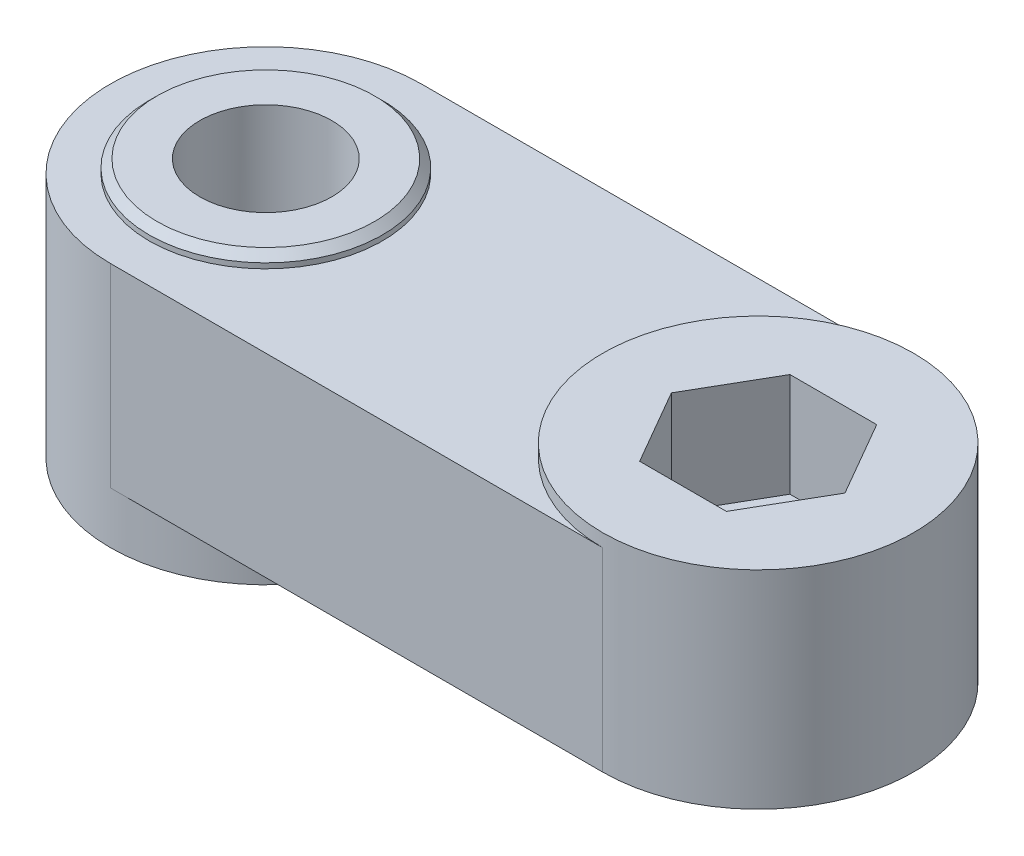
ISO-10303-21;
HEADER;
FILE_DESCRIPTION(('STEP AP214'),'2;1');
FILE_NAME('part.step','',(''),(''),'','','');
FILE_SCHEMA(('AUTOMOTIVE_DESIGN { 1 0 10303 214 1 1 1 1 }'));
ENDSEC;
DATA;
#1=APPLICATION_CONTEXT('core data for automotive mechanical design processes');
#2=APPLICATION_PROTOCOL_DEFINITION('international standard','automotive_design',2000,#1);
#3=PRODUCT_CONTEXT('',#1,'mechanical');
#4=PRODUCT('Part','Part','',(#3));
#5=PRODUCT_RELATED_PRODUCT_CATEGORY('part','',(#4));
#6=PRODUCT_DEFINITION_FORMATION('','',#4);
#7=PRODUCT_DEFINITION_CONTEXT('part definition',#1,'design');
#8=PRODUCT_DEFINITION('design','',#6,#7);
#9=PRODUCT_DEFINITION_SHAPE('','',#8);
#10=(LENGTH_UNIT() NAMED_UNIT(*) SI_UNIT(.MILLI.,.METRE.));
#11=(NAMED_UNIT(*) PLANE_ANGLE_UNIT() SI_UNIT($,.RADIAN.));
#12=(NAMED_UNIT(*) SI_UNIT($,.STERADIAN.) SOLID_ANGLE_UNIT());
#13=UNCERTAINTY_MEASURE_WITH_UNIT(LENGTH_MEASURE(1.E-05),#10,'distance_accuracy_value','');
#14=(GEOMETRIC_REPRESENTATION_CONTEXT(3) GLOBAL_UNCERTAINTY_ASSIGNED_CONTEXT((#13)) GLOBAL_UNIT_ASSIGNED_CONTEXT((#10,
#11,#12)) REPRESENTATION_CONTEXT('',''));
#15=CARTESIAN_POINT('',(0.,0.,0.));
#16=DIRECTION('',(0.,0.,1.));
#17=DIRECTION('',(1.,0.,0.));
#18=AXIS2_PLACEMENT_3D('',#15,#16,#17);
#19=CARTESIAN_POINT('',(0.,10.,0.));
#20=DIRECTION('',(0.,1.,0.));
#21=DIRECTION('',(0.,0.,1.));
#22=AXIS2_PLACEMENT_3D('',#19,#20,#21);
#23=PLANE('',#22);
#24=CARTESIAN_POINT('',(0.,10.,0.));
#25=DIRECTION('',(0.,1.,0.));
#26=DIRECTION('',(0.,0.,1.));
#27=AXIS2_PLACEMENT_3D('',#24,#25,#26);
#28=CIRCLE('',#27,4.2);
#29=CARTESIAN_POINT('',(0.,10.,4.2));
#30=VERTEX_POINT('',#29);
#31=EDGE_CURVE('E50',#30,#30,#28,.T.);
#32=ORIENTED_EDGE('',*,*,#31,.T.);
#33=EDGE_LOOP('',(#32));
#34=FACE_BOUND('',#33,.T.);
#35=CARTESIAN_POINT('',(0.,10.,0.));
#36=DIRECTION('',(0.,1.,0.));
#37=DIRECTION('',(0.,0.,1.));
#38=AXIS2_PLACEMENT_3D('',#35,#36,#37);
#39=CIRCLE('',#38,2.55);
#40=CARTESIAN_POINT('',(0.,10.,2.55));
#41=VERTEX_POINT('',#40);
#42=EDGE_CURVE('E366',#41,#41,#39,.T.);
#43=ORIENTED_EDGE('',*,*,#42,.F.);
#44=EDGE_LOOP('',(#43));
#45=FACE_BOUND('',#44,.T.);
#46=ADVANCED_FACE('F41',(#34,#45),#23,.T.);
#47=CARTESIAN_POINT('',(0.,10.,0.));
#48=DIRECTION('',(0.,-1.,0.));
#49=DIRECTION('',(0.,0.,-1.));
#50=AXIS2_PLACEMENT_3D('',#47,#48,#49);
#51=CYLINDRICAL_SURFACE('',#50,6.);
#52=CARTESIAN_POINT('',(0.,0.,0.));
#53=DIRECTION('',(0.,1.,0.));
#54=DIRECTION('',(0.,0.,1.));
#55=AXIS2_PLACEMENT_3D('',#52,#53,#54);
#56=CIRCLE('',#55,6.);
#57=CARTESIAN_POINT('',(0.,0.,6.));
#58=VERTEX_POINT('',#57);
#59=EDGE_CURVE('E186',#58,#58,#56,.T.);
#60=ORIENTED_EDGE('',*,*,#59,.T.);
#61=EDGE_LOOP('',(#60));
#62=FACE_BOUND('',#61,.T.);
#63=CARTESIAN_POINT('',(0.,9.5,0.));
#64=DIRECTION('',(0.,1.,0.));
#65=DIRECTION('',(0.,0.,1.));
#66=AXIS2_PLACEMENT_3D('',#63,#64,#65);
#67=CIRCLE('',#66,6.);
#68=CARTESIAN_POINT('',(0.,9.5,6.));
#69=VERTEX_POINT('',#68);
#70=CARTESIAN_POINT('',(0.,9.5,-6.));
#71=VERTEX_POINT('',#70);
#72=EDGE_CURVE('E154',#69,#71,#67,.F.);
#73=ORIENTED_EDGE('',*,*,#72,.T.);
#74=DIRECTION('',(0.,-1.,0.));
#75=VECTOR('',#74,1.);
#76=CARTESIAN_POINT('',(0.,10.,-6.));
#77=LINE('',#76,#75);
#78=CARTESIAN_POINT('',(0.,2.,-6.));
#79=VERTEX_POINT('',#78);
#80=EDGE_CURVE('E159',#71,#79,#77,.T.);
#81=ORIENTED_EDGE('',*,*,#80,.T.);
#82=CARTESIAN_POINT('',(0.,2.,0.));
#83=DIRECTION('',(0.,-1.,0.));
#84=DIRECTION('',(0.,0.,-1.));
#85=AXIS2_PLACEMENT_3D('',#82,#83,#84);
#86=CIRCLE('',#85,6.);
#87=CARTESIAN_POINT('',(0.,2.,6.));
#88=VERTEX_POINT('',#87);
#89=EDGE_CURVE('E195',#79,#88,#86,.T.);
#90=ORIENTED_EDGE('',*,*,#89,.T.);
#91=DIRECTION('',(0.,-1.,0.));
#92=VECTOR('',#91,1.);
#93=CARTESIAN_POINT('',(0.,10.,6.));
#94=LINE('',#93,#92);
#95=EDGE_CURVE('E161',#69,#88,#94,.T.);
#96=ORIENTED_EDGE('',*,*,#95,.F.);
#97=EDGE_LOOP('',(#73,#81,#90,#96));
#98=FACE_BOUND('',#97,.T.);
#99=ADVANCED_FACE('F156',(#62,#98),#51,.T.);
#100=CARTESIAN_POINT('',(0.,10.,6.));
#101=DIRECTION('',(0.,0.,-1.));
#102=DIRECTION('',(-1.,0.,0.));
#103=AXIS2_PLACEMENT_3D('',#100,#101,#102);
#104=PLANE('',#103);
#105=DIRECTION('',(1.,0.,0.));
#106=VECTOR('',#105,1.);
#107=CARTESIAN_POINT('',(0.,9.5,6.));
#108=LINE('',#107,#106);
#109=CARTESIAN_POINT('',(19.,9.5,6.));
#110=VERTEX_POINT('',#109);
#111=EDGE_CURVE('E174',#69,#110,#108,.T.);
#112=ORIENTED_EDGE('',*,*,#111,.F.);
#113=ORIENTED_EDGE('',*,*,#95,.T.);
#114=DIRECTION('',(-1.,0.,0.));
#115=VECTOR('',#114,1.);
#116=CARTESIAN_POINT('',(0.,2.,6.));
#117=LINE('',#116,#115);
#118=CARTESIAN_POINT('',(19.,2.,6.));
#119=VERTEX_POINT('',#118);
#120=EDGE_CURVE('E309',#119,#88,#117,.T.);
#121=ORIENTED_EDGE('',*,*,#120,.F.);
#122=DIRECTION('',(0.,-1.,0.));
#123=VECTOR('',#122,1.);
#124=CARTESIAN_POINT('',(19.,10.,6.));
#125=LINE('',#124,#123);
#126=EDGE_CURVE('E183',#110,#119,#125,.T.);
#127=ORIENTED_EDGE('',*,*,#126,.F.);
#128=EDGE_LOOP('',(#112,#113,#121,#127));
#129=FACE_BOUND('',#128,.T.);
#130=ADVANCED_FACE('F219',(#129),#104,.F.);
#131=CARTESIAN_POINT('',(0.,10.,-6.));
#132=DIRECTION('',(0.,0.,1.));
#133=DIRECTION('',(1.,0.,0.));
#134=AXIS2_PLACEMENT_3D('',#131,#132,#133);
#135=PLANE('',#134);
#136=DIRECTION('',(-1.,0.,0.));
#137=VECTOR('',#136,1.);
#138=CARTESIAN_POINT('',(0.,9.5,-6.));
#139=LINE('',#138,#137);
#140=CARTESIAN_POINT('',(19.,9.5,-6.));
#141=VERTEX_POINT('',#140);
#142=EDGE_CURVE('E168',#141,#71,#139,.T.);
#143=ORIENTED_EDGE('',*,*,#142,.F.);
#144=DIRECTION('',(0.,-1.,0.));
#145=VECTOR('',#144,1.);
#146=CARTESIAN_POINT('',(19.,10.,-6.));
#147=LINE('',#146,#145);
#148=CARTESIAN_POINT('',(19.,2.,-6.));
#149=VERTEX_POINT('',#148);
#150=EDGE_CURVE('E180',#141,#149,#147,.T.);
#151=ORIENTED_EDGE('',*,*,#150,.T.);
#152=DIRECTION('',(1.,0.,0.));
#153=VECTOR('',#152,1.);
#154=CARTESIAN_POINT('',(0.,2.,-6.));
#155=LINE('',#154,#153);
#156=EDGE_CURVE('E179',#79,#149,#155,.T.);
#157=ORIENTED_EDGE('',*,*,#156,.F.);
#158=ORIENTED_EDGE('',*,*,#80,.F.);
#159=EDGE_LOOP('',(#143,#151,#157,#158));
#160=FACE_BOUND('',#159,.T.);
#161=ADVANCED_FACE('F177',(#160),#135,.F.);
#162=DIRECTION('',(-1.,0.,0.));
#163=VECTOR('',#162,1.);
#164=CARTESIAN_POINT('',(20.6743157806499,10.,-2.9));
#165=LINE('',#164,#163);
#166=CARTESIAN_POINT('',(20.6743157806499,10.,-2.9));
#167=VERTEX_POINT('',#166);
#168=CARTESIAN_POINT('',(17.3256842193501,10.,-2.9));
#169=VERTEX_POINT('',#168);
#170=EDGE_CURVE('E57',#167,#169,#165,.T.);
#171=ORIENTED_EDGE('',*,*,#170,.F.);
#172=DIRECTION('',(-0.5,0.,-0.866025403784439));
#173=VECTOR('',#172,1.);
#174=CARTESIAN_POINT('',(22.3486315612998,10.,0.));
#175=LINE('',#174,#173);
#176=CARTESIAN_POINT('',(22.3486315612998,10.,0.));
#177=VERTEX_POINT('',#176);
#178=EDGE_CURVE('E265',#177,#167,#175,.T.);
#179=ORIENTED_EDGE('',*,*,#178,.F.);
#180=DIRECTION('',(0.5,0.,-0.866025403784439));
#181=VECTOR('',#180,1.);
#182=CARTESIAN_POINT('',(20.6743157806499,10.,2.9));
#183=LINE('',#182,#181);
#184=CARTESIAN_POINT('',(20.6743157806499,10.,2.9));
#185=VERTEX_POINT('',#184);
#186=EDGE_CURVE('E289',#185,#177,#183,.T.);
#187=ORIENTED_EDGE('',*,*,#186,.F.);
#188=DIRECTION('',(1.,0.,0.));
#189=VECTOR('',#188,1.);
#190=CARTESIAN_POINT('',(17.3256842193501,10.,2.9));
#191=LINE('',#190,#189);
#192=CARTESIAN_POINT('',(17.3256842193501,10.,2.9));
#193=VERTEX_POINT('',#192);
#194=EDGE_CURVE('E286',#193,#185,#191,.T.);
#195=ORIENTED_EDGE('',*,*,#194,.F.);
#196=DIRECTION('',(0.5,0.,0.866025403784439));
#197=VECTOR('',#196,1.);
#198=CARTESIAN_POINT('',(15.6513684387002,10.,0.));
#199=LINE('',#198,#197);
#200=CARTESIAN_POINT('',(15.6513684387002,10.,0.));
#201=VERTEX_POINT('',#200);
#202=EDGE_CURVE('E283',#201,#193,#199,.T.);
#203=ORIENTED_EDGE('',*,*,#202,.F.);
#204=DIRECTION('',(-0.5,0.,0.866025403784439));
#205=VECTOR('',#204,1.);
#206=CARTESIAN_POINT('',(17.3256842193501,10.,-2.9));
#207=LINE('',#206,#205);
#208=EDGE_CURVE('E257',#169,#201,#207,.T.);
#209=ORIENTED_EDGE('',*,*,#208,.F.);
#210=EDGE_LOOP('',(#171,#179,#187,#195,#203,#209));
#211=FACE_BOUND('',#210,.T.);
#212=CARTESIAN_POINT('',(19.,10.,0.));
#213=DIRECTION('',(0.,1.,0.));
#214=DIRECTION('',(0.,0.,1.));
#215=AXIS2_PLACEMENT_3D('',#212,#213,#214);
#216=CIRCLE('',#215,6.);
#217=CARTESIAN_POINT('',(19.,10.,6.));
#218=VERTEX_POINT('',#217);
#219=EDGE_CURVE('E181',#218,#218,#216,.T.);
#220=ORIENTED_EDGE('',*,*,#219,.T.);
#221=EDGE_LOOP('',(#220));
#222=FACE_BOUND('',#221,.T.);
#223=ADVANCED_FACE('F215',(#211,#222),#23,.T.);
#224=CARTESIAN_POINT('',(19.,10.,0.));
#225=DIRECTION('',(0.,1.,0.));
#226=DIRECTION('',(0.,0.,1.));
#227=AXIS2_PLACEMENT_3D('',#224,#225,#226);
#228=CYLINDRICAL_SURFACE('',#227,2.5);
#229=CARTESIAN_POINT('',(19.,5.,0.));
#230=DIRECTION('',(0.,1.,0.));
#231=DIRECTION('',(0.,0.,1.));
#232=AXIS2_PLACEMENT_3D('',#229,#230,#231);
#233=CIRCLE('',#232,2.5);
#234=CARTESIAN_POINT('',(19.,5.,2.5));
#235=VERTEX_POINT('',#234);
#236=EDGE_CURVE('E363',#235,#235,#233,.T.);
#237=ORIENTED_EDGE('',*,*,#236,.F.);
#238=EDGE_LOOP('',(#237));
#239=FACE_BOUND('',#238,.T.);
#240=CARTESIAN_POINT('',(19.,6.,0.));
#241=DIRECTION('',(0.,1.,0.));
#242=DIRECTION('',(0.,0.,1.));
#243=AXIS2_PLACEMENT_3D('',#240,#241,#242);
#244=CIRCLE('',#243,2.5);
#245=CARTESIAN_POINT('',(19.,6.,2.5));
#246=VERTEX_POINT('',#245);
#247=EDGE_CURVE('E196',#246,#246,#244,.F.);
#248=ORIENTED_EDGE('',*,*,#247,.F.);
#249=EDGE_LOOP('',(#248));
#250=FACE_BOUND('',#249,.T.);
#251=ADVANCED_FACE('F224',(#239,#250),#228,.F.);
#252=CARTESIAN_POINT('',(19.,10.,0.));
#253=DIRECTION('',(0.,-1.,0.));
#254=DIRECTION('',(0.,0.,-1.));
#255=AXIS2_PLACEMENT_3D('',#252,#253,#254);
#256=CYLINDRICAL_SURFACE('',#255,6.);
#257=CARTESIAN_POINT('',(19.,9.5,0.));
#258=DIRECTION('',(0.,1.,0.));
#259=DIRECTION('',(0.,0.,1.));
#260=AXIS2_PLACEMENT_3D('',#257,#258,#259);
#261=CIRCLE('',#260,6.);
#262=EDGE_CURVE('E164',#141,#110,#261,.T.);
#263=ORIENTED_EDGE('',*,*,#262,.T.);
#264=ORIENTED_EDGE('',*,*,#126,.T.);
#265=CARTESIAN_POINT('',(19.,2.,0.));
#266=DIRECTION('',(0.,-1.,0.));
#267=DIRECTION('',(0.,0.,-1.));
#268=AXIS2_PLACEMENT_3D('',#265,#266,#267);
#269=CIRCLE('',#268,6.);
#270=EDGE_CURVE('E306',#149,#119,#269,.T.);
#271=ORIENTED_EDGE('',*,*,#270,.F.);
#272=ORIENTED_EDGE('',*,*,#150,.F.);
#273=EDGE_LOOP('',(#263,#264,#271,#272));
#274=FACE_BOUND('',#273,.T.);
#275=ORIENTED_EDGE('',*,*,#219,.F.);
#276=EDGE_LOOP('',(#275));
#277=FACE_BOUND('',#276,.T.);
#278=ADVANCED_FACE('F230',(#274,#277),#256,.T.);
#279=CARTESIAN_POINT('',(0.,0.,0.));
#280=DIRECTION('',(0.,1.,0.));
#281=DIRECTION('',(0.,0.,1.));
#282=AXIS2_PLACEMENT_3D('',#279,#280,#281);
#283=PLANE('',#282);
#284=DIRECTION('',(0.5,0.,-0.866025403784439));
#285=VECTOR('',#284,1.);
#286=CARTESIAN_POINT('',(-4.21465696508427,0.,0.));
#287=LINE('',#286,#285);
#288=CARTESIAN_POINT('',(-4.21465696508427,0.,0.));
#289=VERTEX_POINT('',#288);
#290=CARTESIAN_POINT('',(-2.10732848254214,0.,-3.65));
#291=VERTEX_POINT('',#290);
#292=EDGE_CURVE('E332',#289,#291,#287,.T.);
#293=ORIENTED_EDGE('',*,*,#292,.F.);
#294=DIRECTION('',(-0.5,0.,-0.866025403784438));
#295=VECTOR('',#294,1.);
#296=CARTESIAN_POINT('',(-2.10732848254213,0.,3.65));
#297=LINE('',#296,#295);
#298=CARTESIAN_POINT('',(-2.10732848254213,0.,3.65));
#299=VERTEX_POINT('',#298);
#300=EDGE_CURVE('E65',#299,#289,#297,.T.);
#301=ORIENTED_EDGE('',*,*,#300,.F.);
#302=DIRECTION('',(-1.,0.,0.));
#303=VECTOR('',#302,1.);
#304=CARTESIAN_POINT('',(2.10732848254214,0.,3.65));
#305=LINE('',#304,#303);
#306=CARTESIAN_POINT('',(2.10732848254214,0.,3.65));
#307=VERTEX_POINT('',#306);
#308=EDGE_CURVE('E315',#307,#299,#305,.T.);
#309=ORIENTED_EDGE('',*,*,#308,.F.);
#310=DIRECTION('',(-0.5,0.,0.866025403784439));
#311=VECTOR('',#310,1.);
#312=CARTESIAN_POINT('',(4.21465696508427,0.,0.));
#313=LINE('',#312,#311);
#314=CARTESIAN_POINT('',(4.21465696508427,0.,0.));
#315=VERTEX_POINT('',#314);
#316=EDGE_CURVE('E341',#315,#307,#313,.T.);
#317=ORIENTED_EDGE('',*,*,#316,.F.);
#318=DIRECTION('',(0.5,0.,0.866025403784439));
#319=VECTOR('',#318,1.);
#320=CARTESIAN_POINT('',(2.10732848254213,0.,-3.65));
#321=LINE('',#320,#319);
#322=CARTESIAN_POINT('',(2.10732848254213,0.,-3.65));
#323=VERTEX_POINT('',#322);
#324=EDGE_CURVE('E338',#323,#315,#321,.T.);
#325=ORIENTED_EDGE('',*,*,#324,.F.);
#326=DIRECTION('',(1.,0.,0.));
#327=VECTOR('',#326,1.);
#328=CARTESIAN_POINT('',(-2.10732848254214,0.,-3.65));
#329=LINE('',#328,#327);
#330=EDGE_CURVE('E335',#291,#323,#329,.T.);
#331=ORIENTED_EDGE('',*,*,#330,.F.);
#332=EDGE_LOOP('',(#293,#301,#309,#317,#325,#331));
#333=FACE_BOUND('',#332,.T.);
#334=ORIENTED_EDGE('',*,*,#59,.F.);
#335=EDGE_LOOP('',(#334));
#336=FACE_BOUND('',#335,.T.);
#337=ADVANCED_FACE('F240',(#333,#336),#283,.F.);
#338=CARTESIAN_POINT('',(19.,10.,0.));
#339=DIRECTION('',(0.,1.,0.));
#340=DIRECTION('',(0.,0.,1.));
#341=AXIS2_PLACEMENT_3D('',#338,#339,#340);
#342=CYLINDRICAL_SURFACE('',#341,2.075);
#343=CARTESIAN_POINT('',(19.,5.,0.));
#344=DIRECTION('',(0.,1.,0.));
#345=DIRECTION('',(0.,0.,1.));
#346=AXIS2_PLACEMENT_3D('',#343,#344,#345);
#347=CIRCLE('',#346,2.075);
#348=CARTESIAN_POINT('',(19.,5.,2.075));
#349=VERTEX_POINT('',#348);
#350=EDGE_CURVE('E360',#349,#349,#347,.T.);
#351=ORIENTED_EDGE('',*,*,#350,.T.);
#352=EDGE_LOOP('',(#351));
#353=FACE_BOUND('',#352,.T.);
#354=CARTESIAN_POINT('',(19.,2.,0.));
#355=DIRECTION('',(0.,-1.,0.));
#356=DIRECTION('',(0.,0.,-1.));
#357=AXIS2_PLACEMENT_3D('',#354,#355,#356);
#358=CIRCLE('',#357,2.075);
#359=CARTESIAN_POINT('',(19.,2.,-2.075));
#360=VERTEX_POINT('',#359);
#361=EDGE_CURVE('E192',#360,#360,#358,.F.);
#362=ORIENTED_EDGE('',*,*,#361,.F.);
#363=EDGE_LOOP('',(#362));
#364=FACE_BOUND('',#363,.T.);
#365=ADVANCED_FACE('F246',(#353,#364),#342,.F.);
#366=CARTESIAN_POINT('',(0.,10.,0.));
#367=DIRECTION('',(0.,1.,0.));
#368=DIRECTION('',(0.,0.,1.));
#369=AXIS2_PLACEMENT_3D('',#366,#367,#368);
#370=CYLINDRICAL_SURFACE('',#369,2.55);
#371=CARTESIAN_POINT('',(0.,5.,0.));
#372=DIRECTION('',(0.,-1.,0.));
#373=DIRECTION('',(0.,0.,-1.));
#374=AXIS2_PLACEMENT_3D('',#371,#372,#373);
#375=CIRCLE('',#374,2.55);
#376=CARTESIAN_POINT('',(0.,5.,-2.55));
#377=VERTEX_POINT('',#376);
#378=EDGE_CURVE('E348',#377,#377,#375,.F.);
#379=ORIENTED_EDGE('',*,*,#378,.F.);
#380=EDGE_LOOP('',(#379));
#381=FACE_BOUND('',#380,.T.);
#382=ORIENTED_EDGE('',*,*,#42,.T.);
#383=EDGE_LOOP('',(#382));
#384=FACE_BOUND('',#383,.T.);
#385=ADVANCED_FACE('F373',(#381,#384),#370,.F.);
#386=CARTESIAN_POINT('',(16.5,5.,0.));
#387=DIRECTION('',(0.,-1.,0.));
#388=DIRECTION('',(0.,0.,-1.));
#389=AXIS2_PLACEMENT_3D('',#386,#387,#388);
#390=PLANE('',#389);
#391=ORIENTED_EDGE('',*,*,#350,.F.);
#392=EDGE_LOOP('',(#391));
#393=FACE_BOUND('',#392,.T.);
#394=ORIENTED_EDGE('',*,*,#236,.T.);
#395=EDGE_LOOP('',(#394));
#396=FACE_BOUND('',#395,.T.);
#397=ADVANCED_FACE('F375',(#393,#396),#390,.F.);
#398=CARTESIAN_POINT('',(0.,5.,0.));
#399=DIRECTION('',(0.,-1.,0.));
#400=DIRECTION('',(0.,0.,-1.));
#401=AXIS2_PLACEMENT_3D('',#398,#399,#400);
#402=PLANE('',#401);
#403=DIRECTION('',(-0.5,0.,-0.866025403784438));
#404=VECTOR('',#403,1.);
#405=CARTESIAN_POINT('',(-2.10732848254213,5.,3.65));
#406=LINE('',#405,#404);
#407=CARTESIAN_POINT('',(-2.10732848254213,5.,3.65));
#408=VERTEX_POINT('',#407);
#409=CARTESIAN_POINT('',(-4.21465696508427,5.,0.));
#410=VERTEX_POINT('',#409);
#411=EDGE_CURVE('E311',#408,#410,#406,.T.);
#412=ORIENTED_EDGE('',*,*,#411,.T.);
#413=DIRECTION('',(0.5,0.,-0.866025403784439));
#414=VECTOR('',#413,1.);
#415=CARTESIAN_POINT('',(-4.21465696508427,5.,0.));
#416=LINE('',#415,#414);
#417=CARTESIAN_POINT('',(-2.10732848254214,5.,-3.65));
#418=VERTEX_POINT('',#417);
#419=EDGE_CURVE('E314',#410,#418,#416,.T.);
#420=ORIENTED_EDGE('',*,*,#419,.T.);
#421=DIRECTION('',(1.,0.,0.));
#422=VECTOR('',#421,1.);
#423=CARTESIAN_POINT('',(-2.10732848254214,5.,-3.65));
#424=LINE('',#423,#422);
#425=CARTESIAN_POINT('',(2.10732848254213,5.,-3.65));
#426=VERTEX_POINT('',#425);
#427=EDGE_CURVE('E318',#418,#426,#424,.T.);
#428=ORIENTED_EDGE('',*,*,#427,.T.);
#429=DIRECTION('',(0.5,0.,0.866025403784439));
#430=VECTOR('',#429,1.);
#431=CARTESIAN_POINT('',(2.10732848254213,5.,-3.65));
#432=LINE('',#431,#430);
#433=CARTESIAN_POINT('',(4.21465696508427,5.,0.));
#434=VERTEX_POINT('',#433);
#435=EDGE_CURVE('E321',#426,#434,#432,.T.);
#436=ORIENTED_EDGE('',*,*,#435,.T.);
#437=DIRECTION('',(-0.5,0.,0.866025403784439));
#438=VECTOR('',#437,1.);
#439=CARTESIAN_POINT('',(4.21465696508427,5.,0.));
#440=LINE('',#439,#438);
#441=CARTESIAN_POINT('',(2.10732848254214,5.,3.65));
#442=VERTEX_POINT('',#441);
#443=EDGE_CURVE('E324',#434,#442,#440,.T.);
#444=ORIENTED_EDGE('',*,*,#443,.T.);
#445=DIRECTION('',(-1.,0.,0.));
#446=VECTOR('',#445,1.);
#447=CARTESIAN_POINT('',(2.10732848254214,5.,3.65));
#448=LINE('',#447,#446);
#449=EDGE_CURVE('E327',#442,#408,#448,.T.);
#450=ORIENTED_EDGE('',*,*,#449,.T.);
#451=EDGE_LOOP('',(#412,#420,#428,#436,#444,#450));
#452=FACE_BOUND('',#451,.T.);
#453=ORIENTED_EDGE('',*,*,#378,.T.);
#454=EDGE_LOOP('',(#453));
#455=FACE_BOUND('',#454,.T.);
#456=ADVANCED_FACE('F381',(#452,#455),#402,.T.);
#457=CARTESIAN_POINT('',(-2.10732848254213,5.,3.65));
#458=DIRECTION('',(-0.866025403784438,0.,0.5));
#459=DIRECTION('',(0.5,0.,0.866025403784439));
#460=AXIS2_PLACEMENT_3D('',#457,#458,#459);
#461=PLANE('',#460);
#462=ORIENTED_EDGE('',*,*,#300,.T.);
#463=DIRECTION('',(0.,-1.,0.));
#464=VECTOR('',#463,1.);
#465=CARTESIAN_POINT('',(-4.21465696508427,5.,0.));
#466=LINE('',#465,#464);
#467=EDGE_CURVE('E330',#410,#289,#466,.T.);
#468=ORIENTED_EDGE('',*,*,#467,.F.);
#469=ORIENTED_EDGE('',*,*,#411,.F.);
#470=DIRECTION('',(0.,-1.,0.));
#471=VECTOR('',#470,1.);
#472=CARTESIAN_POINT('',(-2.10732848254213,5.,3.65));
#473=LINE('',#472,#471);
#474=EDGE_CURVE('E346',#408,#299,#473,.T.);
#475=ORIENTED_EDGE('',*,*,#474,.T.);
#476=EDGE_LOOP('',(#462,#468,#469,#475));
#477=FACE_BOUND('',#476,.T.);
#478=ADVANCED_FACE('F388',(#477),#461,.F.);
#479=CARTESIAN_POINT('',(2.10732848254214,5.,3.65));
#480=DIRECTION('',(0.,0.,1.));
#481=DIRECTION('',(1.,0.,0.));
#482=AXIS2_PLACEMENT_3D('',#479,#480,#481);
#483=PLANE('',#482);
#484=ORIENTED_EDGE('',*,*,#308,.T.);
#485=ORIENTED_EDGE('',*,*,#474,.F.);
#486=ORIENTED_EDGE('',*,*,#449,.F.);
#487=DIRECTION('',(0.,-1.,0.));
#488=VECTOR('',#487,1.);
#489=CARTESIAN_POINT('',(2.10732848254214,5.,3.65));
#490=LINE('',#489,#488);
#491=EDGE_CURVE('E349',#442,#307,#490,.T.);
#492=ORIENTED_EDGE('',*,*,#491,.T.);
#493=EDGE_LOOP('',(#484,#485,#486,#492));
#494=FACE_BOUND('',#493,.T.);
#495=ADVANCED_FACE('F391',(#494),#483,.F.);
#496=CARTESIAN_POINT('',(4.21465696508427,5.,0.));
#497=DIRECTION('',(0.866025403784439,0.,0.5));
#498=DIRECTION('',(0.5,0.,-0.866025403784439));
#499=AXIS2_PLACEMENT_3D('',#496,#497,#498);
#500=PLANE('',#499);
#501=ORIENTED_EDGE('',*,*,#316,.T.);
#502=ORIENTED_EDGE('',*,*,#491,.F.);
#503=ORIENTED_EDGE('',*,*,#443,.F.);
#504=DIRECTION('',(0.,-1.,0.));
#505=VECTOR('',#504,1.);
#506=CARTESIAN_POINT('',(4.21465696508427,5.,0.));
#507=LINE('',#506,#505);
#508=EDGE_CURVE('E351',#434,#315,#507,.T.);
#509=ORIENTED_EDGE('',*,*,#508,.T.);
#510=EDGE_LOOP('',(#501,#502,#503,#509));
#511=FACE_BOUND('',#510,.T.);
#512=ADVANCED_FACE('F404',(#511),#500,.F.);
#513=CARTESIAN_POINT('',(2.10732848254213,5.,-3.65));
#514=DIRECTION('',(0.866025403784439,0.,-0.5));
#515=DIRECTION('',(-0.5,0.,-0.866025403784439));
#516=AXIS2_PLACEMENT_3D('',#513,#514,#515);
#517=PLANE('',#516);
#518=ORIENTED_EDGE('',*,*,#324,.T.);
#519=ORIENTED_EDGE('',*,*,#508,.F.);
#520=ORIENTED_EDGE('',*,*,#435,.F.);
#521=DIRECTION('',(0.,-1.,0.));
#522=VECTOR('',#521,1.);
#523=CARTESIAN_POINT('',(2.10732848254213,5.,-3.65));
#524=LINE('',#523,#522);
#525=EDGE_CURVE('E353',#426,#323,#524,.T.);
#526=ORIENTED_EDGE('',*,*,#525,.T.);
#527=EDGE_LOOP('',(#518,#519,#520,#526));
#528=FACE_BOUND('',#527,.T.);
#529=ADVANCED_FACE('F400',(#528),#517,.F.);
#530=CARTESIAN_POINT('',(-2.10732848254214,5.,-3.65));
#531=DIRECTION('',(0.,0.,-1.));
#532=DIRECTION('',(-1.,0.,0.));
#533=AXIS2_PLACEMENT_3D('',#530,#531,#532);
#534=PLANE('',#533);
#535=ORIENTED_EDGE('',*,*,#330,.T.);
#536=ORIENTED_EDGE('',*,*,#525,.F.);
#537=ORIENTED_EDGE('',*,*,#427,.F.);
#538=DIRECTION('',(0.,-1.,0.));
#539=VECTOR('',#538,1.);
#540=CARTESIAN_POINT('',(-2.10732848254214,5.,-3.65));
#541=LINE('',#540,#539);
#542=EDGE_CURVE('E355',#418,#291,#541,.T.);
#543=ORIENTED_EDGE('',*,*,#542,.T.);
#544=EDGE_LOOP('',(#535,#536,#537,#543));
#545=FACE_BOUND('',#544,.T.);
#546=ADVANCED_FACE('F396',(#545),#534,.F.);
#547=CARTESIAN_POINT('',(-4.21465696508427,5.,0.));
#548=DIRECTION('',(-0.866025403784439,0.,-0.5));
#549=DIRECTION('',(-0.5,0.,0.866025403784439));
#550=AXIS2_PLACEMENT_3D('',#547,#548,#549);
#551=PLANE('',#550);
#552=ORIENTED_EDGE('',*,*,#292,.T.);
#553=ORIENTED_EDGE('',*,*,#542,.F.);
#554=ORIENTED_EDGE('',*,*,#419,.F.);
#555=ORIENTED_EDGE('',*,*,#467,.T.);
#556=EDGE_LOOP('',(#552,#553,#554,#555));
#557=FACE_BOUND('',#556,.T.);
#558=ADVANCED_FACE('F392',(#557),#551,.F.);
#559=CARTESIAN_POINT('',(0.,2.,0.));
#560=DIRECTION('',(0.,-1.,0.));
#561=DIRECTION('',(0.,0.,-1.));
#562=AXIS2_PLACEMENT_3D('',#559,#560,#561);
#563=PLANE('',#562);
#564=ORIENTED_EDGE('',*,*,#361,.T.);
#565=EDGE_LOOP('',(#564));
#566=FACE_BOUND('',#565,.T.);
#567=ORIENTED_EDGE('',*,*,#120,.T.);
#568=ORIENTED_EDGE('',*,*,#89,.F.);
#569=ORIENTED_EDGE('',*,*,#156,.T.);
#570=ORIENTED_EDGE('',*,*,#270,.T.);
#571=EDGE_LOOP('',(#567,#568,#569,#570));
#572=FACE_BOUND('',#571,.T.);
#573=ADVANCED_FACE('F395',(#566,#572),#563,.T.);
#574=CARTESIAN_POINT('',(0.,6.,0.));
#575=DIRECTION('',(0.,1.,0.));
#576=DIRECTION('',(0.,0.,1.));
#577=AXIS2_PLACEMENT_3D('',#574,#575,#576);
#578=PLANE('',#577);
#579=DIRECTION('',(-1.,0.,0.));
#580=VECTOR('',#579,1.);
#581=CARTESIAN_POINT('',(20.6743157806499,6.,-2.9));
#582=LINE('',#581,#580);
#583=CARTESIAN_POINT('',(20.6743157806499,6.,-2.9));
#584=VERTEX_POINT('',#583);
#585=CARTESIAN_POINT('',(17.3256842193501,6.,-2.9));
#586=VERTEX_POINT('',#585);
#587=EDGE_CURVE('E261',#584,#586,#582,.T.);
#588=ORIENTED_EDGE('',*,*,#587,.T.);
#589=DIRECTION('',(-0.5,0.,0.866025403784439));
#590=VECTOR('',#589,1.);
#591=CARTESIAN_POINT('',(17.3256842193501,6.,-2.9));
#592=LINE('',#591,#590);
#593=CARTESIAN_POINT('',(15.6513684387002,6.,0.));
#594=VERTEX_POINT('',#593);
#595=EDGE_CURVE('E264',#586,#594,#592,.T.);
#596=ORIENTED_EDGE('',*,*,#595,.T.);
#597=DIRECTION('',(0.5,0.,0.866025403784439));
#598=VECTOR('',#597,1.);
#599=CARTESIAN_POINT('',(15.6513684387002,6.,0.));
#600=LINE('',#599,#598);
#601=CARTESIAN_POINT('',(17.3256842193501,6.,2.9));
#602=VERTEX_POINT('',#601);
#603=EDGE_CURVE('E268',#594,#602,#600,.T.);
#604=ORIENTED_EDGE('',*,*,#603,.T.);
#605=DIRECTION('',(1.,0.,0.));
#606=VECTOR('',#605,1.);
#607=CARTESIAN_POINT('',(17.3256842193501,6.,2.9));
#608=LINE('',#607,#606);
#609=CARTESIAN_POINT('',(20.6743157806499,6.,2.9));
#610=VERTEX_POINT('',#609);
#611=EDGE_CURVE('E271',#602,#610,#608,.T.);
#612=ORIENTED_EDGE('',*,*,#611,.T.);
#613=DIRECTION('',(0.5,0.,-0.866025403784439));
#614=VECTOR('',#613,1.);
#615=CARTESIAN_POINT('',(20.6743157806499,6.,2.9));
#616=LINE('',#615,#614);
#617=CARTESIAN_POINT('',(22.3486315612998,6.,0.));
#618=VERTEX_POINT('',#617);
#619=EDGE_CURVE('E274',#610,#618,#616,.T.);
#620=ORIENTED_EDGE('',*,*,#619,.T.);
#621=DIRECTION('',(-0.5,0.,-0.866025403784439));
#622=VECTOR('',#621,1.);
#623=CARTESIAN_POINT('',(22.3486315612998,6.,0.));
#624=LINE('',#623,#622);
#625=EDGE_CURVE('E277',#618,#584,#624,.T.);
#626=ORIENTED_EDGE('',*,*,#625,.T.);
#627=EDGE_LOOP('',(#588,#596,#604,#612,#620,#626));
#628=FACE_BOUND('',#627,.T.);
#629=ORIENTED_EDGE('',*,*,#247,.T.);
#630=EDGE_LOOP('',(#629));
#631=FACE_BOUND('',#630,.T.);
#632=ADVANCED_FACE('F417',(#628,#631),#578,.T.);
#633=CARTESIAN_POINT('',(20.6743157806499,6.,-2.9));
#634=DIRECTION('',(0.,0.,-1.));
#635=DIRECTION('',(-1.,0.,0.));
#636=AXIS2_PLACEMENT_3D('',#633,#634,#635);
#637=PLANE('',#636);
#638=ORIENTED_EDGE('',*,*,#170,.T.);
#639=DIRECTION('',(0.,1.,0.));
#640=VECTOR('',#639,1.);
#641=CARTESIAN_POINT('',(17.3256842193501,6.,-2.9));
#642=LINE('',#641,#640);
#643=EDGE_CURVE('E279',#586,#169,#642,.T.);
#644=ORIENTED_EDGE('',*,*,#643,.F.);
#645=ORIENTED_EDGE('',*,*,#587,.F.);
#646=DIRECTION('',(0.,1.,0.));
#647=VECTOR('',#646,1.);
#648=CARTESIAN_POINT('',(20.6743157806499,6.,-2.9));
#649=LINE('',#648,#647);
#650=EDGE_CURVE('E198',#584,#167,#649,.T.);
#651=ORIENTED_EDGE('',*,*,#650,.T.);
#652=EDGE_LOOP('',(#638,#644,#645,#651));
#653=FACE_BOUND('',#652,.T.);
#654=ADVANCED_FACE('F419',(#653),#637,.F.);
#655=CARTESIAN_POINT('',(22.3486315612998,6.,0.));
#656=DIRECTION('',(0.866025403784439,0.,-0.5));
#657=DIRECTION('',(-0.5,0.,-0.866025403784439));
#658=AXIS2_PLACEMENT_3D('',#655,#656,#657);
#659=PLANE('',#658);
#660=ORIENTED_EDGE('',*,*,#178,.T.);
#661=ORIENTED_EDGE('',*,*,#650,.F.);
#662=ORIENTED_EDGE('',*,*,#625,.F.);
#663=DIRECTION('',(0.,1.,0.));
#664=VECTOR('',#663,1.);
#665=CARTESIAN_POINT('',(22.3486315612998,6.,0.));
#666=LINE('',#665,#664);
#667=EDGE_CURVE('E295',#618,#177,#666,.T.);
#668=ORIENTED_EDGE('',*,*,#667,.T.);
#669=EDGE_LOOP('',(#660,#661,#662,#668));
#670=FACE_BOUND('',#669,.T.);
#671=ADVANCED_FACE('F422',(#670),#659,.F.);
#672=CARTESIAN_POINT('',(20.6743157806499,6.,2.9));
#673=DIRECTION('',(0.866025403784439,0.,0.5));
#674=DIRECTION('',(0.5,0.,-0.866025403784439));
#675=AXIS2_PLACEMENT_3D('',#672,#673,#674);
#676=PLANE('',#675);
#677=ORIENTED_EDGE('',*,*,#186,.T.);
#678=ORIENTED_EDGE('',*,*,#667,.F.);
#679=ORIENTED_EDGE('',*,*,#619,.F.);
#680=DIRECTION('',(0.,1.,0.));
#681=VECTOR('',#680,1.);
#682=CARTESIAN_POINT('',(20.6743157806499,6.,2.9));
#683=LINE('',#682,#681);
#684=EDGE_CURVE('E297',#610,#185,#683,.T.);
#685=ORIENTED_EDGE('',*,*,#684,.T.);
#686=EDGE_LOOP('',(#677,#678,#679,#685));
#687=FACE_BOUND('',#686,.T.);
#688=ADVANCED_FACE('F434',(#687),#676,.F.);
#689=CARTESIAN_POINT('',(17.3256842193501,6.,2.9));
#690=DIRECTION('',(0.,0.,1.));
#691=DIRECTION('',(1.,0.,0.));
#692=AXIS2_PLACEMENT_3D('',#689,#690,#691);
#693=PLANE('',#692);
#694=ORIENTED_EDGE('',*,*,#194,.T.);
#695=ORIENTED_EDGE('',*,*,#684,.F.);
#696=ORIENTED_EDGE('',*,*,#611,.F.);
#697=DIRECTION('',(0.,1.,0.));
#698=VECTOR('',#697,1.);
#699=CARTESIAN_POINT('',(17.3256842193501,6.,2.9));
#700=LINE('',#699,#698);
#701=EDGE_CURVE('E299',#602,#193,#700,.T.);
#702=ORIENTED_EDGE('',*,*,#701,.T.);
#703=EDGE_LOOP('',(#694,#695,#696,#702));
#704=FACE_BOUND('',#703,.T.);
#705=ADVANCED_FACE('F430',(#704),#693,.F.);
#706=CARTESIAN_POINT('',(15.6513684387002,6.,0.));
#707=DIRECTION('',(-0.866025403784439,0.,0.5));
#708=DIRECTION('',(0.5,0.,0.866025403784439));
#709=AXIS2_PLACEMENT_3D('',#706,#707,#708);
#710=PLANE('',#709);
#711=ORIENTED_EDGE('',*,*,#202,.T.);
#712=ORIENTED_EDGE('',*,*,#701,.F.);
#713=ORIENTED_EDGE('',*,*,#603,.F.);
#714=DIRECTION('',(0.,1.,0.));
#715=VECTOR('',#714,1.);
#716=CARTESIAN_POINT('',(15.6513684387002,6.,0.));
#717=LINE('',#716,#715);
#718=EDGE_CURVE('E301',#594,#201,#717,.T.);
#719=ORIENTED_EDGE('',*,*,#718,.T.);
#720=EDGE_LOOP('',(#711,#712,#713,#719));
#721=FACE_BOUND('',#720,.T.);
#722=ADVANCED_FACE('F426',(#721),#710,.F.);
#723=CARTESIAN_POINT('',(17.3256842193501,6.,-2.9));
#724=DIRECTION('',(-0.866025403784439,0.,-0.5));
#725=DIRECTION('',(-0.5,0.,0.866025403784439));
#726=AXIS2_PLACEMENT_3D('',#723,#724,#725);
#727=PLANE('',#726);
#728=ORIENTED_EDGE('',*,*,#208,.T.);
#729=ORIENTED_EDGE('',*,*,#718,.F.);
#730=ORIENTED_EDGE('',*,*,#595,.F.);
#731=ORIENTED_EDGE('',*,*,#643,.T.);
#732=EDGE_LOOP('',(#728,#729,#730,#731));
#733=FACE_BOUND('',#732,.T.);
#734=ADVANCED_FACE('F423',(#733),#727,.F.);
#735=CARTESIAN_POINT('',(0.,9.5,0.));
#736=DIRECTION('',(0.,1.,0.));
#737=DIRECTION('',(0.,0.,1.));
#738=AXIS2_PLACEMENT_3D('',#735,#736,#737);
#739=PLANE('',#738);
#740=ORIENTED_EDGE('',*,*,#111,.T.);
#741=ORIENTED_EDGE('',*,*,#262,.F.);
#742=ORIENTED_EDGE('',*,*,#142,.T.);
#743=ORIENTED_EDGE('',*,*,#72,.F.);
#744=EDGE_LOOP('',(#740,#741,#742,#743));
#745=FACE_BOUND('',#744,.T.);
#746=CARTESIAN_POINT('',(0.,9.5,0.));
#747=DIRECTION('',(0.,1.,0.));
#748=DIRECTION('',(0.,0.,1.));
#749=AXIS2_PLACEMENT_3D('',#746,#747,#748);
#750=CIRCLE('',#749,4.5);
#751=CARTESIAN_POINT('',(0.,9.5,4.5));
#752=VERTEX_POINT('',#751);
#753=EDGE_CURVE('E165',#752,#752,#750,.F.);
#754=ORIENTED_EDGE('',*,*,#753,.T.);
#755=EDGE_LOOP('',(#754));
#756=FACE_BOUND('',#755,.T.);
#757=ADVANCED_FACE('F169',(#745,#756),#739,.T.);
#758=CARTESIAN_POINT('',(0.,-7.47056274847714,0.));
#759=DIRECTION('',(0.,1.,0.));
#760=DIRECTION('',(0.,0.,1.));
#761=AXIS2_PLACEMENT_3D('',#758,#759,#760);
#762=CYLINDRICAL_SURFACE('',#761,4.5);
#763=CARTESIAN_POINT('',(0.,9.7,0.));
#764=DIRECTION('',(0.,1.,0.));
#765=DIRECTION('',(0.,0.,1.));
#766=AXIS2_PLACEMENT_3D('',#763,#764,#765);
#767=CIRCLE('',#766,4.5);
#768=CARTESIAN_POINT('',(0.,9.7,4.5));
#769=VERTEX_POINT('',#768);
#770=EDGE_CURVE('E11',#769,#769,#767,.F.);
#771=ORIENTED_EDGE('',*,*,#770,.T.);
#772=EDGE_LOOP('',(#771));
#773=FACE_BOUND('',#772,.T.);
#774=ORIENTED_EDGE('',*,*,#753,.F.);
#775=EDGE_LOOP('',(#774));
#776=FACE_BOUND('',#775,.T.);
#777=ADVANCED_FACE('F205',(#773,#776),#762,.T.);
#778=CARTESIAN_POINT('',(0.,10.,0.));
#779=DIRECTION('',(0.,-1.,0.));
#780=DIRECTION('',(0.,0.,-1.));
#781=AXIS2_PLACEMENT_3D('',#778,#779,#780);
#782=CONICAL_SURFACE('',#781,4.2,0.785398163397443);
#783=ORIENTED_EDGE('',*,*,#770,.F.);
#784=EDGE_LOOP('',(#783));
#785=FACE_BOUND('',#784,.T.);
#786=ORIENTED_EDGE('',*,*,#31,.F.);
#787=EDGE_LOOP('',(#786));
#788=FACE_BOUND('',#787,.T.);
#789=ADVANCED_FACE('F44',(#785,#788),#782,.T.);
#790=CLOSED_SHELL('',(#46,#99,#130,#161,#223,#251,#278,#337,#365,#385,#397,#456,#478,#495,#512,
#529,#546,#558,#573,#632,#654,#671,#688,#705,#722,#734,#757,#777,#789));
#791=MANIFOLD_SOLID_BREP('B2',#790);
#792=ADVANCED_BREP_SHAPE_REPRESENTATION('',(#18,#791),#14);
#793=SHAPE_DEFINITION_REPRESENTATION(#9,#792);
ENDSEC;
END-ISO-10303-21;
